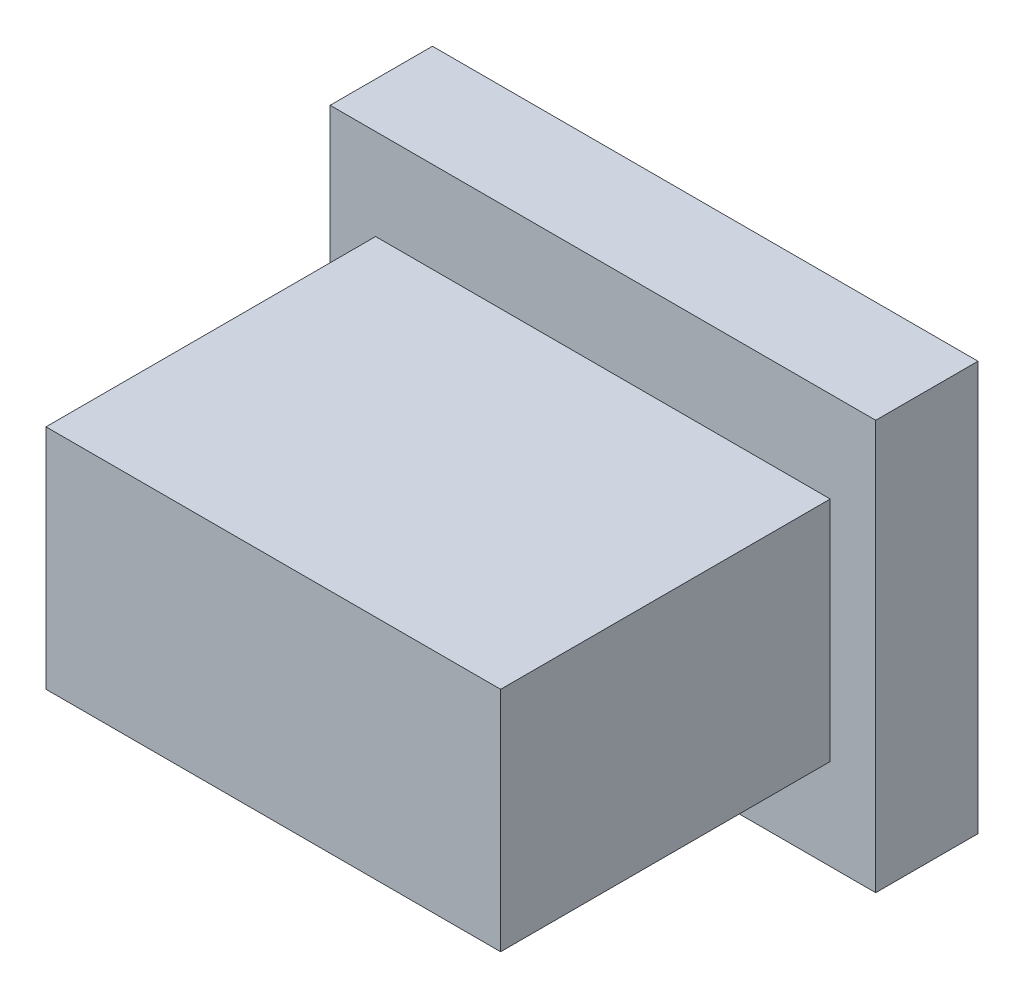
ISO-10303-21;
HEADER;
FILE_DESCRIPTION(('STEP AP214'),'2;1');
FILE_NAME('part.step','',(''),(''),'','','');
FILE_SCHEMA(('AUTOMOTIVE_DESIGN { 1 0 10303 214 1 1 1 1 }'));
ENDSEC;
DATA;
#1=APPLICATION_CONTEXT('core data for automotive mechanical design processes');
#2=APPLICATION_PROTOCOL_DEFINITION('international standard','automotive_design',2000,#1);
#3=PRODUCT_CONTEXT('',#1,'mechanical');
#4=PRODUCT('Part','Part','',(#3));
#5=PRODUCT_RELATED_PRODUCT_CATEGORY('part','',(#4));
#6=PRODUCT_DEFINITION_FORMATION('','',#4);
#7=PRODUCT_DEFINITION_CONTEXT('part definition',#1,'design');
#8=PRODUCT_DEFINITION('design','',#6,#7);
#9=PRODUCT_DEFINITION_SHAPE('','',#8);
#10=(LENGTH_UNIT() NAMED_UNIT(*) SI_UNIT(.MILLI.,.METRE.));
#11=(NAMED_UNIT(*) PLANE_ANGLE_UNIT() SI_UNIT($,.RADIAN.));
#12=(NAMED_UNIT(*) SI_UNIT($,.STERADIAN.) SOLID_ANGLE_UNIT());
#13=UNCERTAINTY_MEASURE_WITH_UNIT(LENGTH_MEASURE(1.E-05),#10,'distance_accuracy_value','');
#14=(GEOMETRIC_REPRESENTATION_CONTEXT(3) GLOBAL_UNCERTAINTY_ASSIGNED_CONTEXT((#13)) GLOBAL_UNIT_ASSIGNED_CONTEXT((#10,
#11,#12)) REPRESENTATION_CONTEXT('',''));
#15=CARTESIAN_POINT('',(0.,0.,0.));
#16=DIRECTION('',(0.,0.,1.));
#17=DIRECTION('',(1.,0.,0.));
#18=AXIS2_PLACEMENT_3D('',#15,#16,#17);
#19=CARTESIAN_POINT('',(0.,-2.,2.25));
#20=DIRECTION('',(0.,1.,0.));
#21=DIRECTION('',(0.,0.,1.));
#22=AXIS2_PLACEMENT_3D('',#19,#20,#21);
#23=PLANE('',#22);
#24=DIRECTION('',(1.,0.,0.));
#25=VECTOR('',#24,1.);
#26=CARTESIAN_POINT('',(0.,-2.,0.));
#27=LINE('',#26,#25);
#28=CARTESIAN_POINT('',(-1.,-2.,0.));
#29=VERTEX_POINT('',#28);
#30=CARTESIAN_POINT('',(11.,-2.,0.));
#31=VERTEX_POINT('',#30);
#32=EDGE_CURVE('E110',#29,#31,#27,.T.);
#33=ORIENTED_EDGE('',*,*,#32,.T.);
#34=DIRECTION('',(0.,0.,-1.));
#35=VECTOR('',#34,1.);
#36=CARTESIAN_POINT('',(11.,-2.,2.25));
#37=LINE('',#36,#35);
#38=CARTESIAN_POINT('',(11.,-2.,2.25));
#39=VERTEX_POINT('',#38);
#40=EDGE_CURVE('E11',#39,#31,#37,.T.);
#41=ORIENTED_EDGE('',*,*,#40,.F.);
#42=DIRECTION('',(1.,0.,0.));
#43=VECTOR('',#42,1.);
#44=CARTESIAN_POINT('',(0.,-2.,2.25));
#45=LINE('',#44,#43);
#46=CARTESIAN_POINT('',(-1.,-2.,2.25));
#47=VERTEX_POINT('',#46);
#48=EDGE_CURVE('E95',#47,#39,#45,.T.);
#49=ORIENTED_EDGE('',*,*,#48,.F.);
#50=DIRECTION('',(0.,0.,-1.));
#51=VECTOR('',#50,1.);
#52=CARTESIAN_POINT('',(-1.,-2.,2.25));
#53=LINE('',#52,#51);
#54=EDGE_CURVE('E51',#47,#29,#53,.T.);
#55=ORIENTED_EDGE('',*,*,#54,.T.);
#56=EDGE_LOOP('',(#33,#41,#49,#55));
#57=FACE_BOUND('',#56,.T.);
#58=ADVANCED_FACE('F35',(#57),#23,.F.);
#59=CARTESIAN_POINT('',(11.,0.,2.25));
#60=DIRECTION('',(-1.,0.,0.));
#61=DIRECTION('',(0.,0.,1.));
#62=AXIS2_PLACEMENT_3D('',#59,#60,#61);
#63=PLANE('',#62);
#64=DIRECTION('',(0.,1.,0.));
#65=VECTOR('',#64,1.);
#66=CARTESIAN_POINT('',(11.,0.,0.));
#67=LINE('',#66,#65);
#68=CARTESIAN_POINT('',(11.,7.,0.));
#69=VERTEX_POINT('',#68);
#70=EDGE_CURVE('E101',#31,#69,#67,.T.);
#71=ORIENTED_EDGE('',*,*,#70,.T.);
#72=DIRECTION('',(0.,0.,-1.));
#73=VECTOR('',#72,1.);
#74=CARTESIAN_POINT('',(11.,7.,2.25));
#75=LINE('',#74,#73);
#76=CARTESIAN_POINT('',(11.,7.,2.25));
#77=VERTEX_POINT('',#76);
#78=EDGE_CURVE('E43',#77,#69,#75,.T.);
#79=ORIENTED_EDGE('',*,*,#78,.F.);
#80=DIRECTION('',(0.,1.,0.));
#81=VECTOR('',#80,1.);
#82=CARTESIAN_POINT('',(11.,0.,2.25));
#83=LINE('',#82,#81);
#84=EDGE_CURVE('E89',#39,#77,#83,.T.);
#85=ORIENTED_EDGE('',*,*,#84,.F.);
#86=ORIENTED_EDGE('',*,*,#40,.T.);
#87=EDGE_LOOP('',(#71,#79,#85,#86));
#88=FACE_BOUND('',#87,.T.);
#89=ADVANCED_FACE('F100',(#88),#63,.F.);
#90=CARTESIAN_POINT('',(0.,7.,2.25));
#91=DIRECTION('',(0.,1.,0.));
#92=DIRECTION('',(0.,0.,1.));
#93=AXIS2_PLACEMENT_3D('',#90,#91,#92);
#94=PLANE('',#93);
#95=DIRECTION('',(1.,0.,0.));
#96=VECTOR('',#95,1.);
#97=CARTESIAN_POINT('',(0.,7.,0.));
#98=LINE('',#97,#96);
#99=CARTESIAN_POINT('',(-1.,7.,0.));
#100=VERTEX_POINT('',#99);
#101=EDGE_CURVE('E114',#100,#69,#98,.T.);
#102=ORIENTED_EDGE('',*,*,#101,.F.);
#103=DIRECTION('',(0.,0.,-1.));
#104=VECTOR('',#103,1.);
#105=CARTESIAN_POINT('',(-1.,7.,2.25));
#106=LINE('',#105,#104);
#107=CARTESIAN_POINT('',(-1.,7.,2.25));
#108=VERTEX_POINT('',#107);
#109=EDGE_CURVE('E66',#108,#100,#106,.T.);
#110=ORIENTED_EDGE('',*,*,#109,.F.);
#111=DIRECTION('',(1.,0.,0.));
#112=VECTOR('',#111,1.);
#113=CARTESIAN_POINT('',(0.,7.,2.25));
#114=LINE('',#113,#112);
#115=EDGE_CURVE('E94',#108,#77,#114,.T.);
#116=ORIENTED_EDGE('',*,*,#115,.T.);
#117=ORIENTED_EDGE('',*,*,#78,.T.);
#118=EDGE_LOOP('',(#102,#110,#116,#117));
#119=FACE_BOUND('',#118,.T.);
#120=ADVANCED_FACE('F104',(#119),#94,.T.);
#121=CARTESIAN_POINT('',(-1.,0.,2.25));
#122=DIRECTION('',(-1.,0.,0.));
#123=DIRECTION('',(0.,-1.,0.));
#124=AXIS2_PLACEMENT_3D('',#121,#122,#123);
#125=PLANE('',#124);
#126=DIRECTION('',(0.,1.,0.));
#127=VECTOR('',#126,1.);
#128=CARTESIAN_POINT('',(-1.,0.,0.));
#129=LINE('',#128,#127);
#130=EDGE_CURVE('E116',#29,#100,#129,.T.);
#131=ORIENTED_EDGE('',*,*,#130,.F.);
#132=ORIENTED_EDGE('',*,*,#54,.F.);
#133=DIRECTION('',(0.,1.,0.));
#134=VECTOR('',#133,1.);
#135=CARTESIAN_POINT('',(-1.,0.,2.25));
#136=LINE('',#135,#134);
#137=EDGE_CURVE('E105',#47,#108,#136,.T.);
#138=ORIENTED_EDGE('',*,*,#137,.T.);
#139=ORIENTED_EDGE('',*,*,#109,.T.);
#140=EDGE_LOOP('',(#131,#132,#138,#139));
#141=FACE_BOUND('',#140,.T.);
#142=ADVANCED_FACE('F191',(#141),#125,.T.);
#143=CARTESIAN_POINT('',(0.,0.,2.25));
#144=DIRECTION('',(0.,0.,1.));
#145=DIRECTION('',(1.,0.,0.));
#146=AXIS2_PLACEMENT_3D('',#143,#144,#145);
#147=PLANE('',#146);
#148=DIRECTION('',(0.,1.,0.));
#149=VECTOR('',#148,1.);
#150=CARTESIAN_POINT('',(10.,0.,2.25));
#151=LINE('',#150,#149);
#152=CARTESIAN_POINT('',(10.,0.,2.25));
#153=VERTEX_POINT('',#152);
#154=CARTESIAN_POINT('',(10.,5.,2.25));
#155=VERTEX_POINT('',#154);
#156=EDGE_CURVE('E119',#153,#155,#151,.T.);
#157=ORIENTED_EDGE('',*,*,#156,.F.);
#158=DIRECTION('',(1.,0.,0.));
#159=VECTOR('',#158,1.);
#160=CARTESIAN_POINT('',(0.,0.,2.25));
#161=LINE('',#160,#159);
#162=CARTESIAN_POINT('',(0.,0.,2.25));
#163=VERTEX_POINT('',#162);
#164=EDGE_CURVE('E123',#163,#153,#161,.T.);
#165=ORIENTED_EDGE('',*,*,#164,.F.);
#166=DIRECTION('',(0.,1.,0.));
#167=VECTOR('',#166,1.);
#168=CARTESIAN_POINT('',(0.,0.,2.25));
#169=LINE('',#168,#167);
#170=CARTESIAN_POINT('',(0.,5.,2.25));
#171=VERTEX_POINT('',#170);
#172=EDGE_CURVE('E132',#163,#171,#169,.T.);
#173=ORIENTED_EDGE('',*,*,#172,.T.);
#174=DIRECTION('',(1.,0.,0.));
#175=VECTOR('',#174,1.);
#176=CARTESIAN_POINT('',(0.,5.,2.25));
#177=LINE('',#176,#175);
#178=EDGE_CURVE('E139',#171,#155,#177,.T.);
#179=ORIENTED_EDGE('',*,*,#178,.T.);
#180=EDGE_LOOP('',(#157,#165,#173,#179));
#181=FACE_BOUND('',#180,.T.);
#182=ORIENTED_EDGE('',*,*,#48,.T.);
#183=ORIENTED_EDGE('',*,*,#84,.T.);
#184=ORIENTED_EDGE('',*,*,#115,.F.);
#185=ORIENTED_EDGE('',*,*,#137,.F.);
#186=EDGE_LOOP('',(#182,#183,#184,#185));
#187=FACE_BOUND('',#186,.T.);
#188=ADVANCED_FACE('F91',(#181,#187),#147,.T.);
#189=CARTESIAN_POINT('',(0.,0.,0.));
#190=DIRECTION('',(0.,0.,1.));
#191=DIRECTION('',(1.,0.,0.));
#192=AXIS2_PLACEMENT_3D('',#189,#190,#191);
#193=PLANE('',#192);
#194=ORIENTED_EDGE('',*,*,#32,.F.);
#195=ORIENTED_EDGE('',*,*,#130,.T.);
#196=ORIENTED_EDGE('',*,*,#101,.T.);
#197=ORIENTED_EDGE('',*,*,#70,.F.);
#198=EDGE_LOOP('',(#194,#195,#196,#197));
#199=FACE_BOUND('',#198,.T.);
#200=ADVANCED_FACE('F185',(#199),#193,.F.);
#201=CARTESIAN_POINT('',(0.,0.,9.5));
#202=DIRECTION('',(0.,1.,0.));
#203=DIRECTION('',(0.,0.,1.));
#204=AXIS2_PLACEMENT_3D('',#201,#202,#203);
#205=PLANE('',#204);
#206=ORIENTED_EDGE('',*,*,#164,.T.);
#207=DIRECTION('',(0.,0.,-1.));
#208=VECTOR('',#207,1.);
#209=CARTESIAN_POINT('',(10.,0.,9.5));
#210=LINE('',#209,#208);
#211=CARTESIAN_POINT('',(10.,0.,9.5));
#212=VERTEX_POINT('',#211);
#213=EDGE_CURVE('E112',#212,#153,#210,.T.);
#214=ORIENTED_EDGE('',*,*,#213,.F.);
#215=DIRECTION('',(1.,0.,0.));
#216=VECTOR('',#215,1.);
#217=CARTESIAN_POINT('',(0.,0.,9.5));
#218=LINE('',#217,#216);
#219=CARTESIAN_POINT('',(0.,0.,9.5));
#220=VERTEX_POINT('',#219);
#221=EDGE_CURVE('E164',#220,#212,#218,.T.);
#222=ORIENTED_EDGE('',*,*,#221,.F.);
#223=DIRECTION('',(0.,0.,-1.));
#224=VECTOR('',#223,1.);
#225=CARTESIAN_POINT('',(0.,0.,9.5));
#226=LINE('',#225,#224);
#227=EDGE_CURVE('E153',#220,#163,#226,.T.);
#228=ORIENTED_EDGE('',*,*,#227,.T.);
#229=EDGE_LOOP('',(#206,#214,#222,#228));
#230=FACE_BOUND('',#229,.T.);
#231=ADVANCED_FACE('F175',(#230),#205,.F.);
#232=CARTESIAN_POINT('',(10.,0.,9.5));
#233=DIRECTION('',(-1.,0.,0.));
#234=DIRECTION('',(0.,-1.,0.));
#235=AXIS2_PLACEMENT_3D('',#232,#233,#234);
#236=PLANE('',#235);
#237=ORIENTED_EDGE('',*,*,#156,.T.);
#238=DIRECTION('',(0.,0.,-1.));
#239=VECTOR('',#238,1.);
#240=CARTESIAN_POINT('',(10.,5.,9.5));
#241=LINE('',#240,#239);
#242=CARTESIAN_POINT('',(10.,5.,9.5));
#243=VERTEX_POINT('',#242);
#244=EDGE_CURVE('E149',#243,#155,#241,.T.);
#245=ORIENTED_EDGE('',*,*,#244,.F.);
#246=DIRECTION('',(0.,1.,0.));
#247=VECTOR('',#246,1.);
#248=CARTESIAN_POINT('',(10.,0.,9.5));
#249=LINE('',#248,#247);
#250=EDGE_CURVE('E161',#212,#243,#249,.T.);
#251=ORIENTED_EDGE('',*,*,#250,.F.);
#252=ORIENTED_EDGE('',*,*,#213,.T.);
#253=EDGE_LOOP('',(#237,#245,#251,#252));
#254=FACE_BOUND('',#253,.T.);
#255=ADVANCED_FACE('F176',(#254),#236,.F.);
#256=CARTESIAN_POINT('',(0.,5.,9.5));
#257=DIRECTION('',(0.,1.,0.));
#258=DIRECTION('',(0.,0.,1.));
#259=AXIS2_PLACEMENT_3D('',#256,#257,#258);
#260=PLANE('',#259);
#261=ORIENTED_EDGE('',*,*,#244,.T.);
#262=ORIENTED_EDGE('',*,*,#178,.F.);
#263=DIRECTION('',(0.,0.,-1.));
#264=VECTOR('',#263,1.);
#265=CARTESIAN_POINT('',(0.,5.,9.5));
#266=LINE('',#265,#264);
#267=CARTESIAN_POINT('',(0.,5.,9.5));
#268=VERTEX_POINT('',#267);
#269=EDGE_CURVE('E79',#268,#171,#266,.T.);
#270=ORIENTED_EDGE('',*,*,#269,.F.);
#271=DIRECTION('',(1.,0.,0.));
#272=VECTOR('',#271,1.);
#273=CARTESIAN_POINT('',(0.,5.,9.5));
#274=LINE('',#273,#272);
#275=EDGE_CURVE('E151',#268,#243,#274,.T.);
#276=ORIENTED_EDGE('',*,*,#275,.T.);
#277=EDGE_LOOP('',(#261,#262,#270,#276));
#278=FACE_BOUND('',#277,.T.);
#279=ADVANCED_FACE('F145',(#278),#260,.T.);
#280=CARTESIAN_POINT('',(0.,0.,9.5));
#281=DIRECTION('',(-1.,0.,0.));
#282=DIRECTION('',(0.,-1.,0.));
#283=AXIS2_PLACEMENT_3D('',#280,#281,#282);
#284=PLANE('',#283);
#285=ORIENTED_EDGE('',*,*,#269,.T.);
#286=ORIENTED_EDGE('',*,*,#172,.F.);
#287=ORIENTED_EDGE('',*,*,#227,.F.);
#288=DIRECTION('',(0.,1.,0.));
#289=VECTOR('',#288,1.);
#290=CARTESIAN_POINT('',(0.,0.,9.5));
#291=LINE('',#290,#289);
#292=EDGE_CURVE('E158',#220,#268,#291,.T.);
#293=ORIENTED_EDGE('',*,*,#292,.T.);
#294=EDGE_LOOP('',(#285,#286,#287,#293));
#295=FACE_BOUND('',#294,.T.);
#296=ADVANCED_FACE('F183',(#295),#284,.T.);
#297=CARTESIAN_POINT('',(0.,0.,9.5));
#298=DIRECTION('',(0.,0.,1.));
#299=DIRECTION('',(1.,0.,0.));
#300=AXIS2_PLACEMENT_3D('',#297,#298,#299);
#301=PLANE('',#300);
#302=ORIENTED_EDGE('',*,*,#221,.T.);
#303=ORIENTED_EDGE('',*,*,#250,.T.);
#304=ORIENTED_EDGE('',*,*,#275,.F.);
#305=ORIENTED_EDGE('',*,*,#292,.F.);
#306=EDGE_LOOP('',(#302,#303,#304,#305));
#307=FACE_BOUND('',#306,.T.);
#308=ADVANCED_FACE('F171',(#307),#301,.T.);
#309=CLOSED_SHELL('',(#58,#89,#120,#142,#188,#200,#231,#255,#279,#296,#308));
#310=MANIFOLD_SOLID_BREP('B2',#309);
#311=ADVANCED_BREP_SHAPE_REPRESENTATION('',(#18,#310),#14);
#312=SHAPE_DEFINITION_REPRESENTATION(#9,#311);
ENDSEC;
END-ISO-10303-21;
